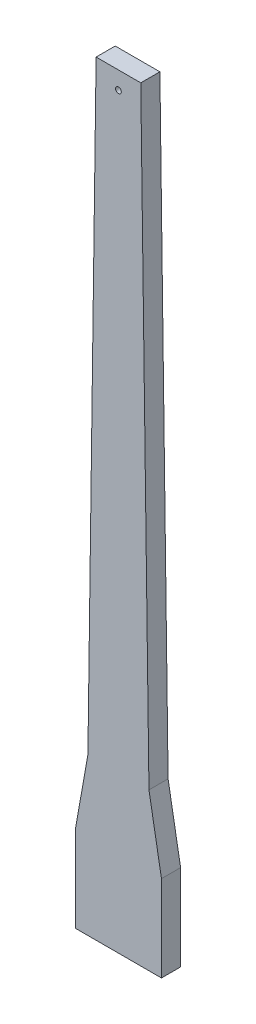
ISO-10303-21;
HEADER;
FILE_DESCRIPTION(('STEP AP214'),'2;1');
FILE_NAME('part.step','',(''),(''),'','','');
FILE_SCHEMA(('AUTOMOTIVE_DESIGN { 1 0 10303 214 1 1 1 1 }'));
ENDSEC;
DATA;
#1=APPLICATION_CONTEXT('core data for automotive mechanical design processes');
#2=APPLICATION_PROTOCOL_DEFINITION('international standard','automotive_design',2000,#1);
#3=PRODUCT_CONTEXT('',#1,'mechanical');
#4=PRODUCT('Part','Part','',(#3));
#5=PRODUCT_RELATED_PRODUCT_CATEGORY('part','',(#4));
#6=PRODUCT_DEFINITION_FORMATION('','',#4);
#7=PRODUCT_DEFINITION_CONTEXT('part definition',#1,'design');
#8=PRODUCT_DEFINITION('design','',#6,#7);
#9=PRODUCT_DEFINITION_SHAPE('','',#8);
#10=(LENGTH_UNIT() NAMED_UNIT(*) SI_UNIT(.MILLI.,.METRE.));
#11=(NAMED_UNIT(*) PLANE_ANGLE_UNIT() SI_UNIT($,.RADIAN.));
#12=(NAMED_UNIT(*) SI_UNIT($,.STERADIAN.) SOLID_ANGLE_UNIT());
#13=UNCERTAINTY_MEASURE_WITH_UNIT(LENGTH_MEASURE(1.E-05),#10,'distance_accuracy_value','');
#14=(GEOMETRIC_REPRESENTATION_CONTEXT(3) GLOBAL_UNCERTAINTY_ASSIGNED_CONTEXT((#13)) GLOBAL_UNIT_ASSIGNED_CONTEXT((#10,
#11,#12)) REPRESENTATION_CONTEXT('',''));
#15=CARTESIAN_POINT('',(0.,0.,0.));
#16=DIRECTION('',(0.,0.,1.));
#17=DIRECTION('',(1.,0.,0.));
#18=AXIS2_PLACEMENT_3D('',#15,#16,#17);
#19=CARTESIAN_POINT('',(-1.71526708980094,160.,-15.305460185916));
#20=DIRECTION('',(-1.,0.,0.));
#21=DIRECTION('',(0.,0.,1.));
#22=AXIS2_PLACEMENT_3D('',#19,#20,#21);
#23=PLANE('',#22);
#24=DIRECTION('',(0.,-1.,0.));
#25=VECTOR('',#24,1.);
#26=CARTESIAN_POINT('',(-1.71526708980094,160.,-15.305460185916));
#27=LINE('',#26,#25);
#28=CARTESIAN_POINT('',(-1.71526708980094,18.,-15.305460185916));
#29=VERTEX_POINT('',#28);
#30=CARTESIAN_POINT('',(-1.71526708980094,0.,-15.305460185916));
#31=VERTEX_POINT('',#30);
#32=EDGE_CURVE('E114',#29,#31,#27,.T.);
#33=ORIENTED_EDGE('',*,*,#32,.F.);
#34=DIRECTION('',(0.,0.,1.));
#35=VECTOR('',#34,1.);
#36=CARTESIAN_POINT('',(-1.71526708980094,18.,-160.));
#37=LINE('',#36,#35);
#38=CARTESIAN_POINT('',(-1.71526708980094,18.,-11.305460185916));
#39=VERTEX_POINT('',#38);
#40=EDGE_CURVE('E187',#29,#39,#37,.T.);
#41=ORIENTED_EDGE('',*,*,#40,.T.);
#42=DIRECTION('',(0.,-1.,0.));
#43=VECTOR('',#42,1.);
#44=CARTESIAN_POINT('',(-1.71526708980094,160.,-11.305460185916));
#45=LINE('',#44,#43);
#46=CARTESIAN_POINT('',(-1.71526708980094,0.,-11.305460185916));
#47=VERTEX_POINT('',#46);
#48=EDGE_CURVE('E127',#39,#47,#45,.T.);
#49=ORIENTED_EDGE('',*,*,#48,.T.);
#50=DIRECTION('',(0.,0.,-1.));
#51=VECTOR('',#50,1.);
#52=CARTESIAN_POINT('',(-1.71526708980094,0.,-15.305460185916));
#53=LINE('',#52,#51);
#54=EDGE_CURVE('E138',#47,#31,#53,.T.);
#55=ORIENTED_EDGE('',*,*,#54,.T.);
#56=EDGE_LOOP('',(#33,#41,#49,#55));
#57=FACE_BOUND('',#56,.T.);
#58=ADVANCED_FACE('F38',(#57),#23,.F.);
#59=CARTESIAN_POINT('',(-19.7152670898009,160.,-15.305460185916));
#60=DIRECTION('',(0.,0.,1.));
#61=DIRECTION('',(1.,0.,0.));
#62=AXIS2_PLACEMENT_3D('',#59,#60,#61);
#63=PLANE('',#62);
#64=CARTESIAN_POINT('',(-10.7152670898009,156.318807469137,-15.305460185916));
#65=DIRECTION('',(0.,0.,1.));
#66=DIRECTION('',(1.,0.,0.));
#67=AXIS2_PLACEMENT_3D('',#64,#65,#66);
#68=CIRCLE('',#67,0.600000000000004);
#69=CARTESIAN_POINT('',(-10.1152670898009,156.318807469137,-15.305460185916));
#70=VERTEX_POINT('',#69);
#71=EDGE_CURVE('E188',#70,#70,#68,.T.);
#72=ORIENTED_EDGE('',*,*,#71,.T.);
#73=EDGE_LOOP('',(#72));
#74=FACE_BOUND('',#73,.T.);
#75=DIRECTION('',(0.,-1.,0.));
#76=VECTOR('',#75,1.);
#77=CARTESIAN_POINT('',(-19.7152670898009,160.,-15.305460185916));
#78=LINE('',#77,#76);
#79=CARTESIAN_POINT('',(-19.7152670898009,18.,-15.305460185916));
#80=VERTEX_POINT('',#79);
#81=CARTESIAN_POINT('',(-19.7152670898009,0.,-15.305460185916));
#82=VERTEX_POINT('',#81);
#83=EDGE_CURVE('E156',#80,#82,#78,.T.);
#84=ORIENTED_EDGE('',*,*,#83,.F.);
#85=DIRECTION('',(0.174311288918484,0.984690598388944,0.));
#86=VECTOR('',#85,1.);
#87=CARTESIAN_POINT('',(4.65799451973389,155.685411586892,-15.305460185916));
#88=LINE('',#87,#86);
#89=CARTESIAN_POINT('',(-17.1005977560237,32.7703589758341,-15.305460185916));
#90=VERTEX_POINT('',#89);
#91=EDGE_CURVE('E143',#80,#90,#88,.T.);
#92=ORIENTED_EDGE('',*,*,#91,.T.);
#93=DIRECTION('',(0.0134670091352413,0.999909315720656,0.));
#94=VECTOR('',#93,1.);
#95=CARTESIAN_POINT('',(-15.3878245940767,159.941717007027,-15.305460185916));
#96=LINE('',#95,#94);
#97=CARTESIAN_POINT('',(-15.3870396252936,160.,-15.305460185916));
#98=VERTEX_POINT('',#97);
#99=EDGE_CURVE('E166',#90,#98,#96,.T.);
#100=ORIENTED_EDGE('',*,*,#99,.T.);
#101=DIRECTION('',(-1.,0.,0.));
#102=VECTOR('',#101,1.);
#103=CARTESIAN_POINT('',(-19.7152670898009,160.,-15.305460185916));
#104=LINE('',#103,#102);
#105=CARTESIAN_POINT('',(-6.04349455430832,160.,-15.305460185916));
#106=VERTEX_POINT('',#105);
#107=EDGE_CURVE('E128',#106,#98,#104,.T.);
#108=ORIENTED_EDGE('',*,*,#107,.F.);
#109=DIRECTION('',(0.0134670091352413,-0.999909315720656,0.));
#110=VECTOR('',#109,1.);
#111=CARTESIAN_POINT('',(-6.04597407155606,160.184101189033,-15.305460185916));
#112=LINE('',#111,#110);
#113=CARTESIAN_POINT('',(-4.3299364235782,32.7703589758341,-15.305460185916));
#114=VERTEX_POINT('',#113);
#115=EDGE_CURVE('E62',#106,#114,#112,.T.);
#116=ORIENTED_EDGE('',*,*,#115,.T.);
#117=DIRECTION('',(0.174311288918484,-0.984690598388944,0.));
#118=VECTOR('',#117,1.);
#119=CARTESIAN_POINT('',(-26.6354483573354,158.774979959932,-15.305460185916));
#120=LINE('',#119,#118);
#121=EDGE_CURVE('E173',#114,#29,#120,.T.);
#122=ORIENTED_EDGE('',*,*,#121,.T.);
#123=ORIENTED_EDGE('',*,*,#32,.T.);
#124=DIRECTION('',(-1.,0.,0.));
#125=VECTOR('',#124,1.);
#126=CARTESIAN_POINT('',(-19.7152670898009,0.,-15.305460185916));
#127=LINE('',#126,#125);
#128=EDGE_CURVE('E142',#31,#82,#127,.T.);
#129=ORIENTED_EDGE('',*,*,#128,.T.);
#130=EDGE_LOOP('',(#84,#92,#100,#108,#116,#122,#123,#129));
#131=FACE_BOUND('',#130,.T.);
#132=ADVANCED_FACE('F171',(#74,#131),#63,.F.);
#133=CARTESIAN_POINT('',(-19.7152670898009,160.,-15.305460185916));
#134=DIRECTION('',(1.,0.,0.));
#135=DIRECTION('',(0.,0.,-1.));
#136=AXIS2_PLACEMENT_3D('',#133,#134,#135);
#137=PLANE('',#136);
#138=DIRECTION('',(0.,-1.,0.));
#139=VECTOR('',#138,1.);
#140=CARTESIAN_POINT('',(-19.7152670898009,160.,-11.305460185916));
#141=LINE('',#140,#139);
#142=CARTESIAN_POINT('',(-19.7152670898009,18.,-11.305460185916));
#143=VERTEX_POINT('',#142);
#144=CARTESIAN_POINT('',(-19.7152670898009,0.,-11.305460185916));
#145=VERTEX_POINT('',#144);
#146=EDGE_CURVE('E132',#143,#145,#141,.T.);
#147=ORIENTED_EDGE('',*,*,#146,.F.);
#148=DIRECTION('',(0.,0.,1.));
#149=VECTOR('',#148,1.);
#150=CARTESIAN_POINT('',(-19.7152670898009,18.,-160.));
#151=LINE('',#150,#149);
#152=EDGE_CURVE('E123',#80,#143,#151,.T.);
#153=ORIENTED_EDGE('',*,*,#152,.F.);
#154=ORIENTED_EDGE('',*,*,#83,.T.);
#155=DIRECTION('',(0.,0.,1.));
#156=VECTOR('',#155,1.);
#157=CARTESIAN_POINT('',(-19.7152670898009,0.,-15.305460185916));
#158=LINE('',#157,#156);
#159=EDGE_CURVE('E147',#82,#145,#158,.T.);
#160=ORIENTED_EDGE('',*,*,#159,.T.);
#161=EDGE_LOOP('',(#147,#153,#154,#160));
#162=FACE_BOUND('',#161,.T.);
#163=ADVANCED_FACE('F220',(#162),#137,.F.);
#164=CARTESIAN_POINT('',(-19.7152670898009,160.,-11.305460185916));
#165=DIRECTION('',(0.,0.,-1.));
#166=DIRECTION('',(-1.,0.,0.));
#167=AXIS2_PLACEMENT_3D('',#164,#165,#166);
#168=PLANE('',#167);
#169=CARTESIAN_POINT('',(-10.7152670898009,156.318807469137,-11.305460185916));
#170=DIRECTION('',(0.,0.,-1.));
#171=DIRECTION('',(-1.,0.,0.));
#172=AXIS2_PLACEMENT_3D('',#169,#170,#171);
#173=CIRCLE('',#172,0.600000000000004);
#174=CARTESIAN_POINT('',(-11.3152670898009,156.318807469137,-11.305460185916));
#175=VERTEX_POINT('',#174);
#176=EDGE_CURVE('E41',#175,#175,#173,.T.);
#177=ORIENTED_EDGE('',*,*,#176,.T.);
#178=EDGE_LOOP('',(#177));
#179=FACE_BOUND('',#178,.T.);
#180=DIRECTION('',(-0.0134670091352413,-0.999909315720656,0.));
#181=VECTOR('',#180,1.);
#182=CARTESIAN_POINT('',(-15.3878245940767,159.941717007027,-11.305460185916));
#183=LINE('',#182,#181);
#184=CARTESIAN_POINT('',(-15.3870396252936,160.,-11.305460185916));
#185=VERTEX_POINT('',#184);
#186=CARTESIAN_POINT('',(-17.1005977560237,32.7703589758341,-11.305460185916));
#187=VERTEX_POINT('',#186);
#188=EDGE_CURVE('E54',#185,#187,#183,.T.);
#189=ORIENTED_EDGE('',*,*,#188,.T.);
#190=DIRECTION('',(-0.174311288918484,-0.984690598388944,0.));
#191=VECTOR('',#190,1.);
#192=CARTESIAN_POINT('',(4.65799451973389,155.685411586892,-11.305460185916));
#193=LINE('',#192,#191);
#194=EDGE_CURVE('E11',#187,#143,#193,.T.);
#195=ORIENTED_EDGE('',*,*,#194,.T.);
#196=ORIENTED_EDGE('',*,*,#146,.T.);
#197=DIRECTION('',(1.,0.,0.));
#198=VECTOR('',#197,1.);
#199=CARTESIAN_POINT('',(-19.7152670898009,0.,-11.305460185916));
#200=LINE('',#199,#198);
#201=EDGE_CURVE('E134',#145,#47,#200,.T.);
#202=ORIENTED_EDGE('',*,*,#201,.T.);
#203=ORIENTED_EDGE('',*,*,#48,.F.);
#204=DIRECTION('',(-0.174311288918484,0.984690598388944,0.));
#205=VECTOR('',#204,1.);
#206=CARTESIAN_POINT('',(-26.6354483573354,158.774979959932,-11.305460185916));
#207=LINE('',#206,#205);
#208=CARTESIAN_POINT('',(-4.3299364235782,32.7703589758341,-11.305460185916));
#209=VERTEX_POINT('',#208);
#210=EDGE_CURVE('E47',#39,#209,#207,.T.);
#211=ORIENTED_EDGE('',*,*,#210,.T.);
#212=DIRECTION('',(-0.0134670091352413,0.999909315720656,0.));
#213=VECTOR('',#212,1.);
#214=CARTESIAN_POINT('',(-6.04597407155606,160.184101189033,-11.305460185916));
#215=LINE('',#214,#213);
#216=CARTESIAN_POINT('',(-6.04349455430832,160.,-11.305460185916));
#217=VERTEX_POINT('',#216);
#218=EDGE_CURVE('E106',#209,#217,#215,.T.);
#219=ORIENTED_EDGE('',*,*,#218,.T.);
#220=DIRECTION('',(1.,0.,0.));
#221=VECTOR('',#220,1.);
#222=CARTESIAN_POINT('',(-19.7152670898009,160.,-11.305460185916));
#223=LINE('',#222,#221);
#224=EDGE_CURVE('E120',#185,#217,#223,.T.);
#225=ORIENTED_EDGE('',*,*,#224,.F.);
#226=EDGE_LOOP('',(#189,#195,#196,#202,#203,#211,#219,#225));
#227=FACE_BOUND('',#226,.T.);
#228=ADVANCED_FACE('F119',(#179,#227),#168,.F.);
#229=CARTESIAN_POINT('',(0.,160.,0.));
#230=DIRECTION('',(0.,1.,0.));
#231=DIRECTION('',(0.,0.,1.));
#232=AXIS2_PLACEMENT_3D('',#229,#230,#231);
#233=PLANE('',#232);
#234=DIRECTION('',(0.,0.,-1.));
#235=VECTOR('',#234,1.);
#236=CARTESIAN_POINT('',(-15.3870396252936,160.,0.));
#237=LINE('',#236,#235);
#238=EDGE_CURVE('E113',#185,#98,#237,.T.);
#239=ORIENTED_EDGE('',*,*,#238,.F.);
#240=ORIENTED_EDGE('',*,*,#224,.T.);
#241=DIRECTION('',(0.,0.,1.));
#242=VECTOR('',#241,1.);
#243=CARTESIAN_POINT('',(-6.04349455430832,160.,0.));
#244=LINE('',#243,#242);
#245=EDGE_CURVE('E103',#106,#217,#244,.T.);
#246=ORIENTED_EDGE('',*,*,#245,.F.);
#247=ORIENTED_EDGE('',*,*,#107,.T.);
#248=EDGE_LOOP('',(#239,#240,#246,#247));
#249=FACE_BOUND('',#248,.T.);
#250=ADVANCED_FACE('F125',(#249),#233,.T.);
#251=CARTESIAN_POINT('',(0.,0.,0.));
#252=DIRECTION('',(0.,1.,0.));
#253=DIRECTION('',(0.,0.,1.));
#254=AXIS2_PLACEMENT_3D('',#251,#252,#253);
#255=PLANE('',#254);
#256=ORIENTED_EDGE('',*,*,#54,.F.);
#257=ORIENTED_EDGE('',*,*,#201,.F.);
#258=ORIENTED_EDGE('',*,*,#159,.F.);
#259=ORIENTED_EDGE('',*,*,#128,.F.);
#260=EDGE_LOOP('',(#256,#257,#258,#259));
#261=FACE_BOUND('',#260,.T.);
#262=ADVANCED_FACE('F226',(#261),#255,.F.);
#263=CARTESIAN_POINT('',(-1.71526708980094,18.,-160.));
#264=DIRECTION('',(-0.984690598388944,-0.174311288918484,0.));
#265=DIRECTION('',(0.174311288918484,-0.984690598388944,0.));
#266=AXIS2_PLACEMENT_3D('',#263,#264,#265);
#267=PLANE('',#266);
#268=DIRECTION('',(0.,0.,1.));
#269=VECTOR('',#268,1.);
#270=CARTESIAN_POINT('',(-4.3299364235782,32.7703589758341,-160.));
#271=LINE('',#270,#269);
#272=EDGE_CURVE('E184',#114,#209,#271,.T.);
#273=ORIENTED_EDGE('',*,*,#272,.T.);
#274=ORIENTED_EDGE('',*,*,#210,.F.);
#275=ORIENTED_EDGE('',*,*,#40,.F.);
#276=ORIENTED_EDGE('',*,*,#121,.F.);
#277=EDGE_LOOP('',(#273,#274,#275,#276));
#278=FACE_BOUND('',#277,.T.);
#279=ADVANCED_FACE('F237',(#278),#267,.F.);
#280=CARTESIAN_POINT('',(-4.3299364235782,32.7703589758341,-160.));
#281=DIRECTION('',(-0.999909315720656,-0.0134670091352413,0.));
#282=DIRECTION('',(0.0134670091352413,-0.999909315720656,0.));
#283=AXIS2_PLACEMENT_3D('',#280,#281,#282);
#284=PLANE('',#283);
#285=ORIENTED_EDGE('',*,*,#245,.T.);
#286=ORIENTED_EDGE('',*,*,#218,.F.);
#287=ORIENTED_EDGE('',*,*,#272,.F.);
#288=ORIENTED_EDGE('',*,*,#115,.F.);
#289=EDGE_LOOP('',(#285,#286,#287,#288));
#290=FACE_BOUND('',#289,.T.);
#291=ADVANCED_FACE('F105',(#290),#284,.F.);
#292=CARTESIAN_POINT('',(-19.7152670898009,18.,-160.));
#293=DIRECTION('',(0.984690598388944,-0.174311288918484,0.));
#294=DIRECTION('',(0.174311288918484,0.984690598388944,0.));
#295=AXIS2_PLACEMENT_3D('',#292,#293,#294);
#296=PLANE('',#295);
#297=ORIENTED_EDGE('',*,*,#152,.T.);
#298=ORIENTED_EDGE('',*,*,#194,.F.);
#299=DIRECTION('',(0.,0.,1.));
#300=VECTOR('',#299,1.);
#301=CARTESIAN_POINT('',(-17.1005977560237,32.7703589758341,-160.));
#302=LINE('',#301,#300);
#303=EDGE_CURVE('E192',#90,#187,#302,.T.);
#304=ORIENTED_EDGE('',*,*,#303,.F.);
#305=ORIENTED_EDGE('',*,*,#91,.F.);
#306=EDGE_LOOP('',(#297,#298,#304,#305));
#307=FACE_BOUND('',#306,.T.);
#308=ADVANCED_FACE('F213',(#307),#296,.F.);
#309=CARTESIAN_POINT('',(-17.1005977560237,32.7703589758341,-160.));
#310=DIRECTION('',(0.999909315720656,-0.0134670091352413,0.));
#311=DIRECTION('',(0.0134670091352413,0.999909315720656,0.));
#312=AXIS2_PLACEMENT_3D('',#309,#310,#311);
#313=PLANE('',#312);
#314=ORIENTED_EDGE('',*,*,#303,.T.);
#315=ORIENTED_EDGE('',*,*,#188,.F.);
#316=ORIENTED_EDGE('',*,*,#238,.T.);
#317=ORIENTED_EDGE('',*,*,#99,.F.);
#318=EDGE_LOOP('',(#314,#315,#316,#317));
#319=FACE_BOUND('',#318,.T.);
#320=ADVANCED_FACE('F165',(#319),#313,.F.);
#321=CARTESIAN_POINT('',(-10.7152670898009,156.318807469137,-160.));
#322=DIRECTION('',(0.,0.,1.));
#323=DIRECTION('',(1.,0.,0.));
#324=AXIS2_PLACEMENT_3D('',#321,#322,#323);
#325=CYLINDRICAL_SURFACE('',#324,0.600000000000004);
#326=ORIENTED_EDGE('',*,*,#176,.F.);
#327=EDGE_LOOP('',(#326));
#328=FACE_BOUND('',#327,.T.);
#329=ORIENTED_EDGE('',*,*,#71,.F.);
#330=EDGE_LOOP('',(#329));
#331=FACE_BOUND('',#330,.T.);
#332=ADVANCED_FACE('F206',(#328,#331),#325,.F.);
#333=CLOSED_SHELL('',(#58,#132,#163,#228,#250,#262,#279,#291,#308,#320,#332));
#334=MANIFOLD_SOLID_BREP('B2',#333);
#335=ADVANCED_BREP_SHAPE_REPRESENTATION('',(#18,#334),#14);
#336=SHAPE_DEFINITION_REPRESENTATION(#9,#335);
ENDSEC;
END-ISO-10303-21;
